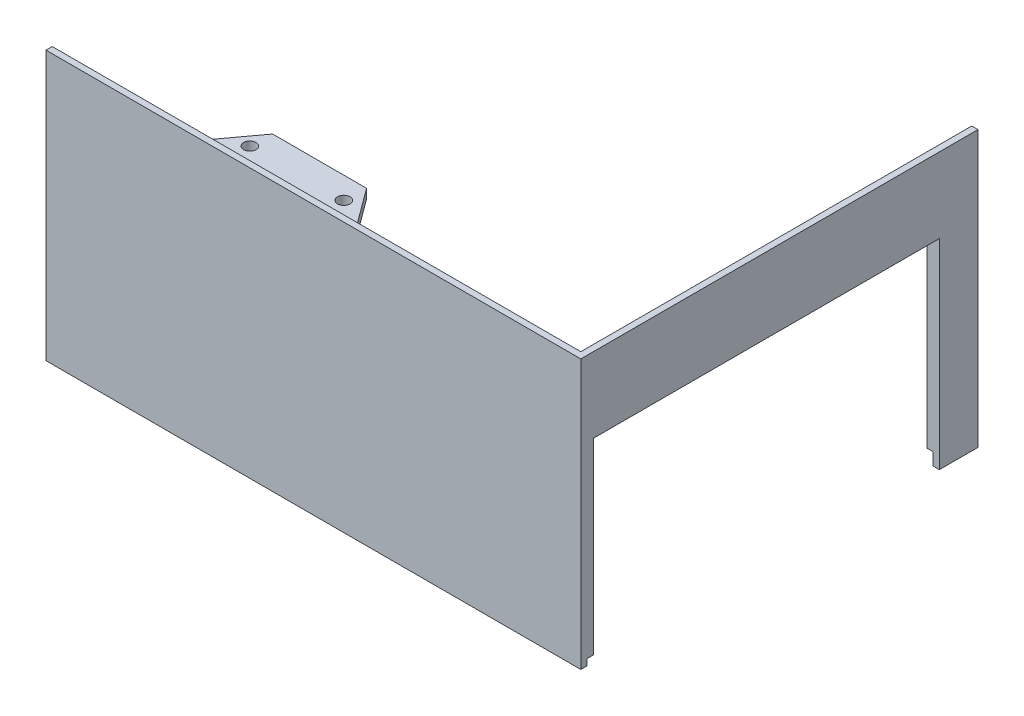
ISO-10303-21;
HEADER;
FILE_DESCRIPTION(('STEP AP214'),'2;1');
FILE_NAME('part.step','',(''),(''),'','','');
FILE_SCHEMA(('AUTOMOTIVE_DESIGN { 1 0 10303 214 1 1 1 1 }'));
ENDSEC;
DATA;
#1=APPLICATION_CONTEXT('core data for automotive mechanical design processes');
#2=APPLICATION_PROTOCOL_DEFINITION('international standard','automotive_design',2000,#1);
#3=PRODUCT_CONTEXT('',#1,'mechanical');
#4=PRODUCT('Part','Part','',(#3));
#5=PRODUCT_RELATED_PRODUCT_CATEGORY('part','',(#4));
#6=PRODUCT_DEFINITION_FORMATION('','',#4);
#7=PRODUCT_DEFINITION_CONTEXT('part definition',#1,'design');
#8=PRODUCT_DEFINITION('design','',#6,#7);
#9=PRODUCT_DEFINITION_SHAPE('','',#8);
#10=(LENGTH_UNIT() NAMED_UNIT(*) SI_UNIT(.MILLI.,.METRE.));
#11=(NAMED_UNIT(*) PLANE_ANGLE_UNIT() SI_UNIT($,.RADIAN.));
#12=(NAMED_UNIT(*) SI_UNIT($,.STERADIAN.) SOLID_ANGLE_UNIT());
#13=UNCERTAINTY_MEASURE_WITH_UNIT(LENGTH_MEASURE(1.E-05),#10,'distance_accuracy_value','');
#14=(GEOMETRIC_REPRESENTATION_CONTEXT(3) GLOBAL_UNCERTAINTY_ASSIGNED_CONTEXT((#13)) GLOBAL_UNIT_ASSIGNED_CONTEXT((#10,
#11,#12)) REPRESENTATION_CONTEXT('',''));
#15=CARTESIAN_POINT('',(0.,0.,0.));
#16=DIRECTION('',(0.,0.,1.));
#17=DIRECTION('',(1.,0.,0.));
#18=AXIS2_PLACEMENT_3D('',#15,#16,#17);
#19=CARTESIAN_POINT('',(0.,0.,-4.));
#20=DIRECTION('',(0.,0.,-1.));
#21=DIRECTION('',(1.,0.,0.));
#22=AXIS2_PLACEMENT_3D('',#19,#20,#21);
#23=PLANE('',#22);
#24=DIRECTION('',(0.,1.,0.));
#25=VECTOR('',#24,1.);
#26=CARTESIAN_POINT('',(9.57742396503259,36.,-4.));
#27=LINE('',#26,#25);
#28=CARTESIAN_POINT('',(9.57742396503259,36.,-4.));
#29=VERTEX_POINT('',#28);
#30=CARTESIAN_POINT('',(9.57742396503259,39.,-4.));
#31=VERTEX_POINT('',#30);
#32=EDGE_CURVE('E224',#29,#31,#27,.T.);
#33=ORIENTED_EDGE('',*,*,#32,.T.);
#34=DIRECTION('',(1.,0.,0.));
#35=VECTOR('',#34,1.);
#36=CARTESIAN_POINT('',(0.,39.,-4.));
#37=LINE('',#36,#35);
#38=CARTESIAN_POINT('',(81.5,39.,-4.));
#39=VERTEX_POINT('',#38);
#40=EDGE_CURVE('E385',#31,#39,#37,.T.);
#41=ORIENTED_EDGE('',*,*,#40,.T.);
#42=DIRECTION('',(0.,-1.,0.));
#43=VECTOR('',#42,1.);
#44=CARTESIAN_POINT('',(81.5,0.,-4.));
#45=LINE('',#44,#43);
#46=CARTESIAN_POINT('',(81.5,19.,-4.));
#47=VERTEX_POINT('',#46);
#48=EDGE_CURVE('E310',#39,#47,#45,.T.);
#49=ORIENTED_EDGE('',*,*,#48,.T.);
#50=DIRECTION('',(1.,0.,0.));
#51=VECTOR('',#50,1.);
#52=CARTESIAN_POINT('',(81.5,19.,-4.));
#53=LINE('',#52,#51);
#54=CARTESIAN_POINT('',(85.5,19.,-4.));
#55=VERTEX_POINT('',#54);
#56=EDGE_CURVE('E332',#47,#55,#53,.T.);
#57=ORIENTED_EDGE('',*,*,#56,.T.);
#58=DIRECTION('',(0.,1.,0.));
#59=VECTOR('',#58,1.);
#60=CARTESIAN_POINT('',(85.5,0.,-4.));
#61=LINE('',#60,#59);
#62=CARTESIAN_POINT('',(85.5,-41.,-4.));
#63=VERTEX_POINT('',#62);
#64=EDGE_CURVE('E382',#63,#55,#61,.T.);
#65=ORIENTED_EDGE('',*,*,#64,.F.);
#66=DIRECTION('',(1.,0.,0.));
#67=VECTOR('',#66,1.);
#68=CARTESIAN_POINT('',(0.,-41.,-4.));
#69=LINE('',#68,#67);
#70=CARTESIAN_POINT('',(9.57742396503259,-41.,-4.));
#71=VERTEX_POINT('',#70);
#72=EDGE_CURVE('E377',#71,#63,#69,.T.);
#73=ORIENTED_EDGE('',*,*,#72,.F.);
#74=DIRECTION('',(0.,-1.,0.));
#75=VECTOR('',#74,1.);
#76=CARTESIAN_POINT('',(9.57742396503259,-38.,-4.));
#77=LINE('',#76,#75);
#78=CARTESIAN_POINT('',(9.57742396503259,-38.,-4.));
#79=VERTEX_POINT('',#78);
#80=EDGE_CURVE('E266',#79,#71,#77,.T.);
#81=ORIENTED_EDGE('',*,*,#80,.F.);
#82=DIRECTION('',(-1.,0.,0.));
#83=VECTOR('',#82,1.);
#84=CARTESIAN_POINT('',(0.,-38.,-4.));
#85=LINE('',#84,#83);
#86=CARTESIAN_POINT('',(-39.6274239650326,-38.,-4.));
#87=VERTEX_POINT('',#86);
#88=EDGE_CURVE('E257',#79,#87,#85,.T.);
#89=ORIENTED_EDGE('',*,*,#88,.T.);
#90=DIRECTION('',(0.,-1.,0.));
#91=VECTOR('',#90,1.);
#92=CARTESIAN_POINT('',(-39.6274239650326,-38.,-4.));
#93=LINE('',#92,#91);
#94=CARTESIAN_POINT('',(-39.6274239650326,-41.,-4.));
#95=VERTEX_POINT('',#94);
#96=EDGE_CURVE('E269',#87,#95,#93,.T.);
#97=ORIENTED_EDGE('',*,*,#96,.T.);
#98=CARTESIAN_POINT('',(-85.5,-41.,-4.));
#99=VERTEX_POINT('',#98);
#100=EDGE_CURVE('E379',#99,#95,#69,.T.);
#101=ORIENTED_EDGE('',*,*,#100,.F.);
#102=DIRECTION('',(0.,1.,0.));
#103=VECTOR('',#102,1.);
#104=CARTESIAN_POINT('',(-85.5,0.,-4.));
#105=LINE('',#104,#103);
#106=CARTESIAN_POINT('',(-85.5,39.,-4.));
#107=VERTEX_POINT('',#106);
#108=EDGE_CURVE('E374',#99,#107,#105,.T.);
#109=ORIENTED_EDGE('',*,*,#108,.T.);
#110=CARTESIAN_POINT('',(-39.6274239650326,39.,-4.));
#111=VERTEX_POINT('',#110);
#112=EDGE_CURVE('E386',#107,#111,#37,.T.);
#113=ORIENTED_EDGE('',*,*,#112,.T.);
#114=DIRECTION('',(0.,1.,0.));
#115=VECTOR('',#114,1.);
#116=CARTESIAN_POINT('',(-39.6274239650326,36.,-4.));
#117=LINE('',#116,#115);
#118=CARTESIAN_POINT('',(-39.6274239650326,36.,-4.));
#119=VERTEX_POINT('',#118);
#120=EDGE_CURVE('E227',#119,#111,#117,.T.);
#121=ORIENTED_EDGE('',*,*,#120,.F.);
#122=DIRECTION('',(-1.,0.,0.));
#123=VECTOR('',#122,1.);
#124=CARTESIAN_POINT('',(0.,36.,-4.));
#125=LINE('',#124,#123);
#126=EDGE_CURVE('E214',#29,#119,#125,.T.);
#127=ORIENTED_EDGE('',*,*,#126,.F.);
#128=EDGE_LOOP('',(#33,#41,#49,#57,#65,#73,#81,#89,#97,#101,#109,#113,#121,#127));
#129=FACE_BOUND('',#128,.T.);
#130=ADVANCED_FACE('F47',(#129),#23,.T.);
#131=CARTESIAN_POINT('',(81.5,-41.,0.));
#132=DIRECTION('',(0.,-1.,0.));
#133=DIRECTION('',(0.,0.,1.));
#134=AXIS2_PLACEMENT_3D('',#131,#132,#133);
#135=PLANE('',#134);
#136=DIRECTION('',(1.,0.,0.));
#137=VECTOR('',#136,1.);
#138=CARTESIAN_POINT('',(81.5,-41.,-114.644000153735));
#139=LINE('',#138,#137);
#140=CARTESIAN_POINT('',(81.5,-41.,-114.644000153735));
#141=VERTEX_POINT('',#140);
#142=CARTESIAN_POINT('',(83.5,-41.,-114.644000153735));
#143=VERTEX_POINT('',#142);
#144=EDGE_CURVE('E318',#141,#143,#139,.T.);
#145=ORIENTED_EDGE('',*,*,#144,.F.);
#146=DIRECTION('',(0.,0.,1.));
#147=VECTOR('',#146,1.);
#148=CARTESIAN_POINT('',(81.5,-41.,0.));
#149=LINE('',#148,#147);
#150=CARTESIAN_POINT('',(81.5,-41.,-127.));
#151=VERTEX_POINT('',#150);
#152=EDGE_CURVE('E302',#151,#141,#149,.T.);
#153=ORIENTED_EDGE('',*,*,#152,.F.);
#154=DIRECTION('',(1.,0.,0.));
#155=VECTOR('',#154,1.);
#156=CARTESIAN_POINT('',(81.5,-41.,-127.));
#157=LINE('',#156,#155);
#158=CARTESIAN_POINT('',(83.5,-41.,-127.));
#159=VERTEX_POINT('',#158);
#160=EDGE_CURVE('E325',#151,#159,#157,.T.);
#161=ORIENTED_EDGE('',*,*,#160,.T.);
#162=DIRECTION('',(0.,0.,1.));
#163=VECTOR('',#162,1.);
#164=CARTESIAN_POINT('',(83.5,-41.,0.));
#165=LINE('',#164,#163);
#166=EDGE_CURVE('E281',#159,#143,#165,.T.);
#167=ORIENTED_EDGE('',*,*,#166,.T.);
#168=EDGE_LOOP('',(#145,#153,#161,#167));
#169=FACE_BOUND('',#168,.T.);
#170=ADVANCED_FACE('F484',(#169),#135,.T.);
#171=CARTESIAN_POINT('',(0.,39.,-4.));
#172=DIRECTION('',(0.,1.,0.));
#173=DIRECTION('',(0.,0.,-1.));
#174=AXIS2_PLACEMENT_3D('',#171,#172,#173);
#175=PLANE('',#174);
#176=CARTESIAN_POINT('',(-0.300000000000009,39.,-10.02));
#177=DIRECTION('',(0.,-1.,0.));
#178=DIRECTION('',(0.,0.,-1.));
#179=AXIS2_PLACEMENT_3D('',#176,#177,#178);
#180=CIRCLE('',#179,2.);
#181=CARTESIAN_POINT('',(-0.300000000000009,39.,-12.02));
#182=VERTEX_POINT('',#181);
#183=EDGE_CURVE('E474',#182,#182,#180,.T.);
#184=ORIENTED_EDGE('',*,*,#183,.T.);
#185=EDGE_LOOP('',(#184));
#186=FACE_BOUND('',#185,.T.);
#187=CARTESIAN_POINT('',(-30.35,39.,-10.02));
#188=DIRECTION('',(0.,-1.,0.));
#189=DIRECTION('',(0.,0.,-1.));
#190=AXIS2_PLACEMENT_3D('',#187,#188,#189);
#191=CIRCLE('',#190,2.);
#192=CARTESIAN_POINT('',(-30.35,39.,-12.02));
#193=VERTEX_POINT('',#192);
#194=EDGE_CURVE('E662',#193,#193,#191,.T.);
#195=ORIENTED_EDGE('',*,*,#194,.T.);
#196=EDGE_LOOP('',(#195));
#197=FACE_BOUND('',#196,.T.);
#198=DIRECTION('',(1.,0.,0.));
#199=VECTOR('',#198,1.);
#200=CARTESIAN_POINT('',(81.5,39.,-127.));
#201=LINE('',#200,#199);
#202=CARTESIAN_POINT('',(81.5,39.,-127.));
#203=VERTEX_POINT('',#202);
#204=CARTESIAN_POINT('',(83.5,39.,-127.));
#205=VERTEX_POINT('',#204);
#206=EDGE_CURVE('E329',#203,#205,#201,.T.);
#207=ORIENTED_EDGE('',*,*,#206,.F.);
#208=DIRECTION('',(0.,0.,-1.));
#209=VECTOR('',#208,1.);
#210=CARTESIAN_POINT('',(81.5,39.,0.));
#211=LINE('',#210,#209);
#212=EDGE_CURVE('E313',#39,#203,#211,.T.);
#213=ORIENTED_EDGE('',*,*,#212,.F.);
#214=ORIENTED_EDGE('',*,*,#40,.F.);
#215=DIRECTION('',(0.593137889518411,0.,0.805100890583065));
#216=VECTOR('',#215,1.);
#217=CARTESIAN_POINT('',(8.11810933252715,39.,-5.98081345170003));
#218=LINE('',#217,#216);
#219=CARTESIAN_POINT('',(0.,39.,-17.));
#220=VERTEX_POINT('',#219);
#221=EDGE_CURVE('E62',#220,#31,#218,.T.);
#222=ORIENTED_EDGE('',*,*,#221,.F.);
#223=DIRECTION('',(1.,0.,0.));
#224=VECTOR('',#223,1.);
#225=CARTESIAN_POINT('',(0.,39.,-17.));
#226=LINE('',#225,#224);
#227=CARTESIAN_POINT('',(-30.05,39.,-17.));
#228=VERTEX_POINT('',#227);
#229=EDGE_CURVE('E219',#228,#220,#226,.T.);
#230=ORIENTED_EDGE('',*,*,#229,.F.);
#231=DIRECTION('',(-0.59313788951841,0.,0.805100890583066));
#232=VECTOR('',#231,1.);
#233=CARTESIAN_POINT('',(-27.5961420252574,39.,-20.3307655365495));
#234=LINE('',#233,#232);
#235=EDGE_CURVE('E466',#228,#111,#234,.T.);
#236=ORIENTED_EDGE('',*,*,#235,.T.);
#237=ORIENTED_EDGE('',*,*,#112,.F.);
#238=DIRECTION('',(0.,0.,1.));
#239=VECTOR('',#238,1.);
#240=CARTESIAN_POINT('',(-85.5,39.,-4.));
#241=LINE('',#240,#239);
#242=CARTESIAN_POINT('',(-85.5,39.,-2.));
#243=VERTEX_POINT('',#242);
#244=EDGE_CURVE('E388',#107,#243,#241,.T.);
#245=ORIENTED_EDGE('',*,*,#244,.T.);
#246=DIRECTION('',(1.,0.,0.));
#247=VECTOR('',#246,1.);
#248=CARTESIAN_POINT('',(0.,39.,-2.));
#249=LINE('',#248,#247);
#250=CARTESIAN_POINT('',(83.5,39.,-2.));
#251=VERTEX_POINT('',#250);
#252=EDGE_CURVE('E360',#243,#251,#249,.T.);
#253=ORIENTED_EDGE('',*,*,#252,.T.);
#254=DIRECTION('',(0.,0.,-1.));
#255=VECTOR('',#254,1.);
#256=CARTESIAN_POINT('',(83.5,39.,0.));
#257=LINE('',#256,#255);
#258=EDGE_CURVE('E289',#251,#205,#257,.T.);
#259=ORIENTED_EDGE('',*,*,#258,.T.);
#260=EDGE_LOOP('',(#207,#213,#214,#222,#230,#236,#237,#245,#253,#259));
#261=FACE_BOUND('',#260,.T.);
#262=ADVANCED_FACE('F463',(#186,#197,#261),#175,.T.);
#263=CARTESIAN_POINT('',(0.,0.,-2.));
#264=DIRECTION('',(0.,0.,-1.));
#265=DIRECTION('',(1.,0.,0.));
#266=AXIS2_PLACEMENT_3D('',#263,#264,#265);
#267=PLANE('',#266);
#268=ORIENTED_EDGE('',*,*,#252,.F.);
#269=DIRECTION('',(0.,1.,0.));
#270=VECTOR('',#269,1.);
#271=CARTESIAN_POINT('',(-85.5,0.,-2.));
#272=LINE('',#271,#270);
#273=CARTESIAN_POINT('',(-85.5,43.,-2.));
#274=VERTEX_POINT('',#273);
#275=EDGE_CURVE('E357',#243,#274,#272,.T.);
#276=ORIENTED_EDGE('',*,*,#275,.T.);
#277=DIRECTION('',(-1.,0.,0.));
#278=VECTOR('',#277,1.);
#279=CARTESIAN_POINT('',(0.,43.,-2.));
#280=LINE('',#279,#278);
#281=CARTESIAN_POINT('',(83.5,43.,-2.));
#282=VERTEX_POINT('',#281);
#283=EDGE_CURVE('E363',#282,#274,#280,.T.);
#284=ORIENTED_EDGE('',*,*,#283,.F.);
#285=DIRECTION('',(0.,-1.,0.));
#286=VECTOR('',#285,1.);
#287=CARTESIAN_POINT('',(83.5,0.,-2.));
#288=LINE('',#287,#286);
#289=EDGE_CURVE('E293',#282,#251,#288,.T.);
#290=ORIENTED_EDGE('',*,*,#289,.T.);
#291=EDGE_LOOP('',(#268,#276,#284,#290));
#292=FACE_BOUND('',#291,.T.);
#293=ADVANCED_FACE('F458',(#292),#267,.T.);
#294=CARTESIAN_POINT('',(-85.5,0.,-4.));
#295=DIRECTION('',(-1.,0.,0.));
#296=DIRECTION('',(0.,0.,-1.));
#297=AXIS2_PLACEMENT_3D('',#294,#295,#296);
#298=PLANE('',#297);
#299=DIRECTION('',(0.,1.,0.));
#300=VECTOR('',#299,1.);
#301=CARTESIAN_POINT('',(-85.5,0.,0.));
#302=LINE('',#301,#300);
#303=CARTESIAN_POINT('',(-85.5,-43.,0.));
#304=VERTEX_POINT('',#303);
#305=CARTESIAN_POINT('',(-85.5,43.,0.));
#306=VERTEX_POINT('',#305);
#307=EDGE_CURVE('E373',#304,#306,#302,.T.);
#308=ORIENTED_EDGE('',*,*,#307,.T.);
#309=DIRECTION('',(0.,0.,1.));
#310=VECTOR('',#309,1.);
#311=CARTESIAN_POINT('',(-85.5,43.,-2.));
#312=LINE('',#311,#310);
#313=EDGE_CURVE('E366',#274,#306,#312,.T.);
#314=ORIENTED_EDGE('',*,*,#313,.F.);
#315=ORIENTED_EDGE('',*,*,#275,.F.);
#316=ORIENTED_EDGE('',*,*,#244,.F.);
#317=ORIENTED_EDGE('',*,*,#108,.F.);
#318=DIRECTION('',(0.,0.,1.));
#319=VECTOR('',#318,1.);
#320=CARTESIAN_POINT('',(-85.5,-41.,-4.));
#321=LINE('',#320,#319);
#322=CARTESIAN_POINT('',(-85.5,-41.,-2.));
#323=VERTEX_POINT('',#322);
#324=EDGE_CURVE('E11',#99,#323,#321,.T.);
#325=ORIENTED_EDGE('',*,*,#324,.T.);
#326=DIRECTION('',(0.,1.,0.));
#327=VECTOR('',#326,1.);
#328=CARTESIAN_POINT('',(-85.5,0.,-2.));
#329=LINE('',#328,#327);
#330=CARTESIAN_POINT('',(-85.5,-43.,-2.));
#331=VERTEX_POINT('',#330);
#332=EDGE_CURVE('E342',#331,#323,#329,.T.);
#333=ORIENTED_EDGE('',*,*,#332,.F.);
#334=DIRECTION('',(0.,0.,1.));
#335=VECTOR('',#334,1.);
#336=CARTESIAN_POINT('',(-85.5,-43.,-2.));
#337=LINE('',#336,#335);
#338=EDGE_CURVE('E353',#331,#304,#337,.T.);
#339=ORIENTED_EDGE('',*,*,#338,.T.);
#340=EDGE_LOOP('',(#308,#314,#315,#316,#317,#325,#333,#339));
#341=FACE_BOUND('',#340,.T.);
#342=ADVANCED_FACE('F49',(#341),#298,.T.);
#343=CARTESIAN_POINT('',(0.,-41.,-4.));
#344=DIRECTION('',(0.,1.,0.));
#345=DIRECTION('',(0.,0.,-1.));
#346=AXIS2_PLACEMENT_3D('',#343,#344,#345);
#347=PLANE('',#346);
#348=CARTESIAN_POINT('',(-0.300000000000009,-41.,-10.02));
#349=DIRECTION('',(0.,-1.,0.));
#350=DIRECTION('',(0.,0.,-1.));
#351=AXIS2_PLACEMENT_3D('',#348,#349,#350);
#352=CIRCLE('',#351,2.);
#353=CARTESIAN_POINT('',(-0.300000000000009,-41.,-12.02));
#354=VERTEX_POINT('',#353);
#355=EDGE_CURVE('E237',#354,#354,#352,.T.);
#356=ORIENTED_EDGE('',*,*,#355,.F.);
#357=EDGE_LOOP('',(#356));
#358=FACE_BOUND('',#357,.T.);
#359=CARTESIAN_POINT('',(-30.35,-41.,-10.02));
#360=DIRECTION('',(0.,-1.,0.));
#361=DIRECTION('',(0.,0.,-1.));
#362=AXIS2_PLACEMENT_3D('',#359,#360,#361);
#363=CIRCLE('',#362,2.);
#364=CARTESIAN_POINT('',(-30.35,-41.,-12.02));
#365=VERTEX_POINT('',#364);
#366=EDGE_CURVE('E247',#365,#365,#363,.T.);
#367=ORIENTED_EDGE('',*,*,#366,.F.);
#368=EDGE_LOOP('',(#367));
#369=FACE_BOUND('',#368,.T.);
#370=ORIENTED_EDGE('',*,*,#324,.F.);
#371=ORIENTED_EDGE('',*,*,#100,.T.);
#372=DIRECTION('',(-0.59313788951841,0.,0.805100890583066));
#373=VECTOR('',#372,1.);
#374=CARTESIAN_POINT('',(-27.5961420252574,-41.,-20.3307655365495));
#375=LINE('',#374,#373);
#376=CARTESIAN_POINT('',(-30.05,-41.,-17.));
#377=VERTEX_POINT('',#376);
#378=EDGE_CURVE('E253',#377,#95,#375,.T.);
#379=ORIENTED_EDGE('',*,*,#378,.F.);
#380=DIRECTION('',(1.,0.,0.));
#381=VECTOR('',#380,1.);
#382=CARTESIAN_POINT('',(0.,-41.,-17.));
#383=LINE('',#382,#381);
#384=CARTESIAN_POINT('',(0.,-41.,-17.));
#385=VERTEX_POINT('',#384);
#386=EDGE_CURVE('E262',#377,#385,#383,.T.);
#387=ORIENTED_EDGE('',*,*,#386,.T.);
#388=DIRECTION('',(0.593137889518411,0.,0.805100890583065));
#389=VECTOR('',#388,1.);
#390=CARTESIAN_POINT('',(8.11810933252715,-41.,-5.98081345170003));
#391=LINE('',#390,#389);
#392=EDGE_CURVE('E240',#385,#71,#391,.T.);
#393=ORIENTED_EDGE('',*,*,#392,.T.);
#394=ORIENTED_EDGE('',*,*,#72,.T.);
#395=DIRECTION('',(0.,0.,1.));
#396=VECTOR('',#395,1.);
#397=CARTESIAN_POINT('',(85.5,-41.,-4.));
#398=LINE('',#397,#396);
#399=CARTESIAN_POINT('',(85.5,-41.,-2.));
#400=VERTEX_POINT('',#399);
#401=EDGE_CURVE('E55',#63,#400,#398,.T.);
#402=ORIENTED_EDGE('',*,*,#401,.T.);
#403=DIRECTION('',(1.,0.,0.));
#404=VECTOR('',#403,1.);
#405=CARTESIAN_POINT('',(0.,-41.,-2.));
#406=LINE('',#405,#404);
#407=EDGE_CURVE('E339',#323,#400,#406,.T.);
#408=ORIENTED_EDGE('',*,*,#407,.F.);
#409=EDGE_LOOP('',(#370,#371,#379,#387,#393,#394,#402,#408));
#410=FACE_BOUND('',#409,.T.);
#411=ADVANCED_FACE('F397',(#358,#369,#410),#347,.F.);
#412=CARTESIAN_POINT('',(85.5,0.,-4.));
#413=DIRECTION('',(-1.,0.,0.));
#414=DIRECTION('',(0.,0.,-1.));
#415=AXIS2_PLACEMENT_3D('',#412,#413,#414);
#416=PLANE('',#415);
#417=DIRECTION('',(0.,1.,0.));
#418=VECTOR('',#417,1.);
#419=CARTESIAN_POINT('',(85.5,0.,0.));
#420=LINE('',#419,#418);
#421=CARTESIAN_POINT('',(85.5,-43.,0.));
#422=VERTEX_POINT('',#421);
#423=CARTESIAN_POINT('',(85.5,43.,0.));
#424=VERTEX_POINT('',#423);
#425=EDGE_CURVE('E378',#422,#424,#420,.T.);
#426=ORIENTED_EDGE('',*,*,#425,.F.);
#427=DIRECTION('',(0.,0.,1.));
#428=VECTOR('',#427,1.);
#429=CARTESIAN_POINT('',(85.5,-43.,-2.));
#430=LINE('',#429,#428);
#431=CARTESIAN_POINT('',(85.5,-43.,-2.));
#432=VERTEX_POINT('',#431);
#433=EDGE_CURVE('E349',#432,#422,#430,.T.);
#434=ORIENTED_EDGE('',*,*,#433,.F.);
#435=DIRECTION('',(0.,1.,0.));
#436=VECTOR('',#435,1.);
#437=CARTESIAN_POINT('',(85.5,0.,-2.));
#438=LINE('',#437,#436);
#439=EDGE_CURVE('E347',#432,#400,#438,.T.);
#440=ORIENTED_EDGE('',*,*,#439,.T.);
#441=ORIENTED_EDGE('',*,*,#401,.F.);
#442=ORIENTED_EDGE('',*,*,#64,.T.);
#443=DIRECTION('',(0.,0.,1.));
#444=VECTOR('',#443,1.);
#445=CARTESIAN_POINT('',(85.5,19.,0.));
#446=LINE('',#445,#444);
#447=CARTESIAN_POINT('',(85.5,19.,-114.644000153735));
#448=VERTEX_POINT('',#447);
#449=EDGE_CURVE('E321',#448,#55,#446,.T.);
#450=ORIENTED_EDGE('',*,*,#449,.F.);
#451=DIRECTION('',(0.,1.,0.));
#452=VECTOR('',#451,1.);
#453=CARTESIAN_POINT('',(85.5,0.,-114.644000153735));
#454=LINE('',#453,#452);
#455=CARTESIAN_POINT('',(85.5,-45.,-114.644000153735));
#456=VERTEX_POINT('',#455);
#457=EDGE_CURVE('E301',#456,#448,#454,.T.);
#458=ORIENTED_EDGE('',*,*,#457,.F.);
#459=DIRECTION('',(0.,0.,-1.));
#460=VECTOR('',#459,1.);
#461=CARTESIAN_POINT('',(85.5,-45.,0.));
#462=LINE('',#461,#460);
#463=CARTESIAN_POINT('',(85.5,-45.,-127.));
#464=VERTEX_POINT('',#463);
#465=EDGE_CURVE('E268',#456,#464,#462,.T.);
#466=ORIENTED_EDGE('',*,*,#465,.T.);
#467=DIRECTION('',(0.,1.,0.));
#468=VECTOR('',#467,1.);
#469=CARTESIAN_POINT('',(85.5,0.,-127.));
#470=LINE('',#469,#468);
#471=CARTESIAN_POINT('',(85.5,43.,-127.));
#472=VERTEX_POINT('',#471);
#473=EDGE_CURVE('E306',#464,#472,#470,.T.);
#474=ORIENTED_EDGE('',*,*,#473,.T.);
#475=DIRECTION('',(0.,0.,1.));
#476=VECTOR('',#475,1.);
#477=CARTESIAN_POINT('',(85.5,43.,-2.));
#478=LINE('',#477,#476);
#479=EDGE_CURVE('E370',#472,#424,#478,.T.);
#480=ORIENTED_EDGE('',*,*,#479,.T.);
#481=EDGE_LOOP('',(#426,#434,#440,#441,#442,#450,#458,#466,#474,#480));
#482=FACE_BOUND('',#481,.T.);
#483=ADVANCED_FACE('F402',(#482),#416,.F.);
#484=CARTESIAN_POINT('',(0.,0.,0.));
#485=DIRECTION('',(0.,0.,-1.));
#486=DIRECTION('',(1.,0.,0.));
#487=AXIS2_PLACEMENT_3D('',#484,#485,#486);
#488=PLANE('',#487);
#489=ORIENTED_EDGE('',*,*,#307,.F.);
#490=DIRECTION('',(-1.,0.,0.));
#491=VECTOR('',#490,1.);
#492=CARTESIAN_POINT('',(0.,-43.,0.));
#493=LINE('',#492,#491);
#494=EDGE_CURVE('E328',#422,#304,#493,.T.);
#495=ORIENTED_EDGE('',*,*,#494,.F.);
#496=ORIENTED_EDGE('',*,*,#425,.T.);
#497=DIRECTION('',(-1.,0.,0.));
#498=VECTOR('',#497,1.);
#499=CARTESIAN_POINT('',(0.,43.,0.));
#500=LINE('',#499,#498);
#501=EDGE_CURVE('E356',#424,#306,#500,.T.);
#502=ORIENTED_EDGE('',*,*,#501,.T.);
#503=EDGE_LOOP('',(#489,#495,#496,#502));
#504=FACE_BOUND('',#503,.T.);
#505=ADVANCED_FACE('F449',(#504),#488,.F.);
#506=CARTESIAN_POINT('',(0.,43.,-2.));
#507=DIRECTION('',(0.,-1.,0.));
#508=DIRECTION('',(1.,0.,0.));
#509=AXIS2_PLACEMENT_3D('',#506,#507,#508);
#510=PLANE('',#509);
#511=ORIENTED_EDGE('',*,*,#501,.F.);
#512=ORIENTED_EDGE('',*,*,#479,.F.);
#513=DIRECTION('',(1.,0.,0.));
#514=VECTOR('',#513,1.);
#515=CARTESIAN_POINT('',(83.5,43.,-127.));
#516=LINE('',#515,#514);
#517=CARTESIAN_POINT('',(83.5,43.,-127.));
#518=VERTEX_POINT('',#517);
#519=EDGE_CURVE('E299',#518,#472,#516,.T.);
#520=ORIENTED_EDGE('',*,*,#519,.F.);
#521=DIRECTION('',(0.,0.,1.));
#522=VECTOR('',#521,1.);
#523=CARTESIAN_POINT('',(83.5,43.,0.));
#524=LINE('',#523,#522);
#525=EDGE_CURVE('E295',#518,#282,#524,.T.);
#526=ORIENTED_EDGE('',*,*,#525,.T.);
#527=ORIENTED_EDGE('',*,*,#283,.T.);
#528=ORIENTED_EDGE('',*,*,#313,.T.);
#529=EDGE_LOOP('',(#511,#512,#520,#526,#527,#528));
#530=FACE_BOUND('',#529,.T.);
#531=ADVANCED_FACE('F454',(#530),#510,.F.);
#532=CARTESIAN_POINT('',(0.,-43.,-2.));
#533=DIRECTION('',(0.,-1.,0.));
#534=DIRECTION('',(1.,0.,0.));
#535=AXIS2_PLACEMENT_3D('',#532,#533,#534);
#536=PLANE('',#535);
#537=ORIENTED_EDGE('',*,*,#494,.T.);
#538=ORIENTED_EDGE('',*,*,#338,.F.);
#539=DIRECTION('',(-1.,0.,0.));
#540=VECTOR('',#539,1.);
#541=CARTESIAN_POINT('',(0.,-43.,-2.));
#542=LINE('',#541,#540);
#543=EDGE_CURVE('E345',#432,#331,#542,.T.);
#544=ORIENTED_EDGE('',*,*,#543,.F.);
#545=ORIENTED_EDGE('',*,*,#433,.T.);
#546=EDGE_LOOP('',(#537,#538,#544,#545));
#547=FACE_BOUND('',#546,.T.);
#548=ADVANCED_FACE('F451',(#547),#536,.T.);
#549=CARTESIAN_POINT('',(0.,0.,-2.));
#550=DIRECTION('',(0.,0.,-1.));
#551=DIRECTION('',(1.,0.,0.));
#552=AXIS2_PLACEMENT_3D('',#549,#550,#551);
#553=PLANE('',#552);
#554=ORIENTED_EDGE('',*,*,#407,.T.);
#555=ORIENTED_EDGE('',*,*,#439,.F.);
#556=ORIENTED_EDGE('',*,*,#543,.T.);
#557=ORIENTED_EDGE('',*,*,#332,.T.);
#558=EDGE_LOOP('',(#554,#555,#556,#557));
#559=FACE_BOUND('',#558,.T.);
#560=ADVANCED_FACE('F407',(#559),#553,.T.);
#561=CARTESIAN_POINT('',(81.5,0.,-127.));
#562=DIRECTION('',(0.,0.,1.));
#563=DIRECTION('',(-1.,0.,0.));
#564=AXIS2_PLACEMENT_3D('',#561,#562,#563);
#565=PLANE('',#564);
#566=ORIENTED_EDGE('',*,*,#473,.F.);
#567=DIRECTION('',(1.,0.,0.));
#568=VECTOR('',#567,1.);
#569=CARTESIAN_POINT('',(83.5,-45.,-127.));
#570=LINE('',#569,#568);
#571=CARTESIAN_POINT('',(83.5,-45.,-127.));
#572=VERTEX_POINT('',#571);
#573=EDGE_CURVE('E284',#572,#464,#570,.T.);
#574=ORIENTED_EDGE('',*,*,#573,.F.);
#575=DIRECTION('',(0.,1.,0.));
#576=VECTOR('',#575,1.);
#577=CARTESIAN_POINT('',(83.5,0.,-127.));
#578=LINE('',#577,#576);
#579=EDGE_CURVE('E275',#572,#159,#578,.T.);
#580=ORIENTED_EDGE('',*,*,#579,.T.);
#581=ORIENTED_EDGE('',*,*,#160,.F.);
#582=DIRECTION('',(0.,1.,0.));
#583=VECTOR('',#582,1.);
#584=CARTESIAN_POINT('',(81.5,0.,-127.));
#585=LINE('',#584,#583);
#586=EDGE_CURVE('E316',#151,#203,#585,.T.);
#587=ORIENTED_EDGE('',*,*,#586,.T.);
#588=ORIENTED_EDGE('',*,*,#206,.T.);
#589=DIRECTION('',(0.,1.,0.));
#590=VECTOR('',#589,1.);
#591=CARTESIAN_POINT('',(83.5,0.,-127.));
#592=LINE('',#591,#590);
#593=EDGE_CURVE('E297',#205,#518,#592,.T.);
#594=ORIENTED_EDGE('',*,*,#593,.T.);
#595=ORIENTED_EDGE('',*,*,#519,.T.);
#596=EDGE_LOOP('',(#566,#574,#580,#581,#587,#588,#594,#595));
#597=FACE_BOUND('',#596,.T.);
#598=ADVANCED_FACE('F443',(#597),#565,.F.);
#599=CARTESIAN_POINT('',(81.5,19.,0.));
#600=DIRECTION('',(0.,-1.,0.));
#601=DIRECTION('',(0.,0.,1.));
#602=AXIS2_PLACEMENT_3D('',#599,#600,#601);
#603=PLANE('',#602);
#604=ORIENTED_EDGE('',*,*,#449,.T.);
#605=ORIENTED_EDGE('',*,*,#56,.F.);
#606=DIRECTION('',(0.,0.,1.));
#607=VECTOR('',#606,1.);
#608=CARTESIAN_POINT('',(81.5,19.,0.));
#609=LINE('',#608,#607);
#610=CARTESIAN_POINT('',(81.5,19.,-114.644000153735));
#611=VERTEX_POINT('',#610);
#612=EDGE_CURVE('E308',#611,#47,#609,.T.);
#613=ORIENTED_EDGE('',*,*,#612,.F.);
#614=DIRECTION('',(1.,0.,0.));
#615=VECTOR('',#614,1.);
#616=CARTESIAN_POINT('',(81.5,19.,-114.644000153735));
#617=LINE('',#616,#615);
#618=EDGE_CURVE('E335',#611,#448,#617,.T.);
#619=ORIENTED_EDGE('',*,*,#618,.T.);
#620=EDGE_LOOP('',(#604,#605,#613,#619));
#621=FACE_BOUND('',#620,.T.);
#622=ADVANCED_FACE('F429',(#621),#603,.T.);
#623=CARTESIAN_POINT('',(81.5,0.,-114.644000153735));
#624=DIRECTION('',(0.,0.,1.));
#625=DIRECTION('',(-1.,0.,0.));
#626=AXIS2_PLACEMENT_3D('',#623,#624,#625);
#627=PLANE('',#626);
#628=ORIENTED_EDGE('',*,*,#457,.T.);
#629=ORIENTED_EDGE('',*,*,#618,.F.);
#630=DIRECTION('',(0.,1.,0.));
#631=VECTOR('',#630,1.);
#632=CARTESIAN_POINT('',(81.5,0.,-114.644000153735));
#633=LINE('',#632,#631);
#634=EDGE_CURVE('E305',#141,#611,#633,.T.);
#635=ORIENTED_EDGE('',*,*,#634,.F.);
#636=ORIENTED_EDGE('',*,*,#144,.T.);
#637=DIRECTION('',(0.,1.,0.));
#638=VECTOR('',#637,1.);
#639=CARTESIAN_POINT('',(83.5,0.,-114.644000153735));
#640=LINE('',#639,#638);
#641=CARTESIAN_POINT('',(83.5,-45.,-114.644000153735));
#642=VERTEX_POINT('',#641);
#643=EDGE_CURVE('E279',#642,#143,#640,.T.);
#644=ORIENTED_EDGE('',*,*,#643,.F.);
#645=DIRECTION('',(1.,0.,0.));
#646=VECTOR('',#645,1.);
#647=CARTESIAN_POINT('',(83.5,-45.,-114.644000153735));
#648=LINE('',#647,#646);
#649=EDGE_CURVE('E287',#642,#456,#648,.T.);
#650=ORIENTED_EDGE('',*,*,#649,.T.);
#651=EDGE_LOOP('',(#628,#629,#635,#636,#644,#650));
#652=FACE_BOUND('',#651,.T.);
#653=ADVANCED_FACE('F434',(#652),#627,.T.);
#654=CARTESIAN_POINT('',(81.5,0.,0.));
#655=DIRECTION('',(1.,0.,0.));
#656=DIRECTION('',(0.,0.,1.));
#657=AXIS2_PLACEMENT_3D('',#654,#655,#656);
#658=PLANE('',#657);
#659=ORIENTED_EDGE('',*,*,#152,.T.);
#660=ORIENTED_EDGE('',*,*,#634,.T.);
#661=ORIENTED_EDGE('',*,*,#612,.T.);
#662=ORIENTED_EDGE('',*,*,#48,.F.);
#663=ORIENTED_EDGE('',*,*,#212,.T.);
#664=ORIENTED_EDGE('',*,*,#586,.F.);
#665=EDGE_LOOP('',(#659,#660,#661,#662,#663,#664));
#666=FACE_BOUND('',#665,.T.);
#667=ADVANCED_FACE('F480',(#666),#658,.F.);
#668=CARTESIAN_POINT('',(83.5,0.,0.));
#669=DIRECTION('',(1.,0.,0.));
#670=DIRECTION('',(0.,0.,1.));
#671=AXIS2_PLACEMENT_3D('',#668,#669,#670);
#672=PLANE('',#671);
#673=ORIENTED_EDGE('',*,*,#258,.F.);
#674=ORIENTED_EDGE('',*,*,#289,.F.);
#675=ORIENTED_EDGE('',*,*,#525,.F.);
#676=ORIENTED_EDGE('',*,*,#593,.F.);
#677=EDGE_LOOP('',(#673,#674,#675,#676));
#678=FACE_BOUND('',#677,.T.);
#679=ADVANCED_FACE('F490',(#678),#672,.F.);
#680=CARTESIAN_POINT('',(83.5,-45.,0.));
#681=DIRECTION('',(0.,1.,0.));
#682=DIRECTION('',(0.,0.,-1.));
#683=AXIS2_PLACEMENT_3D('',#680,#681,#682);
#684=PLANE('',#683);
#685=ORIENTED_EDGE('',*,*,#465,.F.);
#686=ORIENTED_EDGE('',*,*,#649,.F.);
#687=DIRECTION('',(0.,0.,-1.));
#688=VECTOR('',#687,1.);
#689=CARTESIAN_POINT('',(83.5,-45.,0.));
#690=LINE('',#689,#688);
#691=EDGE_CURVE('E277',#642,#572,#690,.T.);
#692=ORIENTED_EDGE('',*,*,#691,.T.);
#693=ORIENTED_EDGE('',*,*,#573,.T.);
#694=EDGE_LOOP('',(#685,#686,#692,#693));
#695=FACE_BOUND('',#694,.T.);
#696=ADVANCED_FACE('F438',(#695),#684,.F.);
#697=CARTESIAN_POINT('',(83.5,0.,0.));
#698=DIRECTION('',(1.,0.,0.));
#699=DIRECTION('',(0.,0.,1.));
#700=AXIS2_PLACEMENT_3D('',#697,#698,#699);
#701=PLANE('',#700);
#702=ORIENTED_EDGE('',*,*,#579,.F.);
#703=ORIENTED_EDGE('',*,*,#691,.F.);
#704=ORIENTED_EDGE('',*,*,#643,.T.);
#705=ORIENTED_EDGE('',*,*,#166,.F.);
#706=EDGE_LOOP('',(#702,#703,#704,#705));
#707=FACE_BOUND('',#706,.T.);
#708=ADVANCED_FACE('F488',(#707),#701,.F.);
#709=CARTESIAN_POINT('',(8.11810933252715,-38.,-5.98081345170003));
#710=DIRECTION('',(-0.805100890583065,0.,0.593137889518411));
#711=DIRECTION('',(-0.593137889518411,0.,-0.805100890583066));
#712=AXIS2_PLACEMENT_3D('',#709,#710,#711);
#713=PLANE('',#712);
#714=ORIENTED_EDGE('',*,*,#392,.F.);
#715=DIRECTION('',(0.,-1.,0.));
#716=VECTOR('',#715,1.);
#717=CARTESIAN_POINT('',(0.,-38.,-17.));
#718=LINE('',#717,#716);
#719=CARTESIAN_POINT('',(0.,-38.,-17.));
#720=VERTEX_POINT('',#719);
#721=EDGE_CURVE('E260',#720,#385,#718,.T.);
#722=ORIENTED_EDGE('',*,*,#721,.F.);
#723=DIRECTION('',(0.593137889518411,0.,0.805100890583065));
#724=VECTOR('',#723,1.);
#725=CARTESIAN_POINT('',(8.11810933252715,-38.,-5.98081345170003));
#726=LINE('',#725,#724);
#727=EDGE_CURVE('E70',#720,#79,#726,.T.);
#728=ORIENTED_EDGE('',*,*,#727,.T.);
#729=ORIENTED_EDGE('',*,*,#80,.T.);
#730=EDGE_LOOP('',(#714,#722,#728,#729));
#731=FACE_BOUND('',#730,.T.);
#732=ADVANCED_FACE('F424',(#731),#713,.F.);
#733=CARTESIAN_POINT('',(-27.5961420252574,-38.,-20.3307655365495));
#734=DIRECTION('',(-0.805100890583066,0.,-0.59313788951841));
#735=DIRECTION('',(0.59313788951841,0.,-0.805100890583066));
#736=AXIS2_PLACEMENT_3D('',#733,#734,#735);
#737=PLANE('',#736);
#738=ORIENTED_EDGE('',*,*,#378,.T.);
#739=ORIENTED_EDGE('',*,*,#96,.F.);
#740=DIRECTION('',(-0.59313788951841,0.,0.805100890583066));
#741=VECTOR('',#740,1.);
#742=CARTESIAN_POINT('',(-27.5961420252574,-38.,-20.3307655365495));
#743=LINE('',#742,#741);
#744=CARTESIAN_POINT('',(-30.05,-38.,-17.));
#745=VERTEX_POINT('',#744);
#746=EDGE_CURVE('E255',#745,#87,#743,.T.);
#747=ORIENTED_EDGE('',*,*,#746,.F.);
#748=DIRECTION('',(0.,-1.,0.));
#749=VECTOR('',#748,1.);
#750=CARTESIAN_POINT('',(-30.05,-38.,-17.));
#751=LINE('',#750,#749);
#752=EDGE_CURVE('E272',#745,#377,#751,.T.);
#753=ORIENTED_EDGE('',*,*,#752,.T.);
#754=EDGE_LOOP('',(#738,#739,#747,#753));
#755=FACE_BOUND('',#754,.T.);
#756=ADVANCED_FACE('F418',(#755),#737,.T.);
#757=CARTESIAN_POINT('',(0.,-38.,-17.));
#758=DIRECTION('',(0.,0.,1.));
#759=DIRECTION('',(-1.,0.,0.));
#760=AXIS2_PLACEMENT_3D('',#757,#758,#759);
#761=PLANE('',#760);
#762=ORIENTED_EDGE('',*,*,#386,.F.);
#763=ORIENTED_EDGE('',*,*,#752,.F.);
#764=DIRECTION('',(1.,0.,0.));
#765=VECTOR('',#764,1.);
#766=CARTESIAN_POINT('',(0.,-38.,-17.));
#767=LINE('',#766,#765);
#768=EDGE_CURVE('E252',#745,#720,#767,.T.);
#769=ORIENTED_EDGE('',*,*,#768,.T.);
#770=ORIENTED_EDGE('',*,*,#721,.T.);
#771=EDGE_LOOP('',(#762,#763,#769,#770));
#772=FACE_BOUND('',#771,.T.);
#773=ADVANCED_FACE('F422',(#772),#761,.F.);
#774=CARTESIAN_POINT('',(0.,-38.,0.));
#775=DIRECTION('',(0.,-1.,0.));
#776=DIRECTION('',(0.,0.,1.));
#777=AXIS2_PLACEMENT_3D('',#774,#775,#776);
#778=PLANE('',#777);
#779=CARTESIAN_POINT('',(-0.300000000000009,-38.,-10.02));
#780=DIRECTION('',(0.,-1.,0.));
#781=DIRECTION('',(0.,0.,-1.));
#782=AXIS2_PLACEMENT_3D('',#779,#780,#781);
#783=CIRCLE('',#782,2.);
#784=CARTESIAN_POINT('',(-0.300000000000009,-38.,-12.02));
#785=VERTEX_POINT('',#784);
#786=EDGE_CURVE('E241',#785,#785,#783,.T.);
#787=ORIENTED_EDGE('',*,*,#786,.T.);
#788=EDGE_LOOP('',(#787));
#789=FACE_BOUND('',#788,.T.);
#790=CARTESIAN_POINT('',(-30.35,-38.,-10.02));
#791=DIRECTION('',(0.,-1.,0.));
#792=DIRECTION('',(0.,0.,-1.));
#793=AXIS2_PLACEMENT_3D('',#790,#791,#792);
#794=CIRCLE('',#793,2.);
#795=CARTESIAN_POINT('',(-30.35,-38.,-12.02));
#796=VERTEX_POINT('',#795);
#797=EDGE_CURVE('E244',#796,#796,#794,.T.);
#798=ORIENTED_EDGE('',*,*,#797,.T.);
#799=EDGE_LOOP('',(#798));
#800=FACE_BOUND('',#799,.T.);
#801=ORIENTED_EDGE('',*,*,#727,.F.);
#802=ORIENTED_EDGE('',*,*,#768,.F.);
#803=ORIENTED_EDGE('',*,*,#746,.T.);
#804=ORIENTED_EDGE('',*,*,#88,.F.);
#805=EDGE_LOOP('',(#801,#802,#803,#804));
#806=FACE_BOUND('',#805,.T.);
#807=ADVANCED_FACE('F527',(#789,#800,#806),#778,.F.);
#808=CARTESIAN_POINT('',(-30.35,-41.,-10.02));
#809=DIRECTION('',(0.,1.,0.));
#810=DIRECTION('',(0.,0.,-1.));
#811=AXIS2_PLACEMENT_3D('',#808,#809,#810);
#812=CYLINDRICAL_SURFACE('',#811,2.);
#813=ORIENTED_EDGE('',*,*,#366,.T.);
#814=EDGE_LOOP('',(#813));
#815=FACE_BOUND('',#814,.T.);
#816=ORIENTED_EDGE('',*,*,#797,.F.);
#817=EDGE_LOOP('',(#816));
#818=FACE_BOUND('',#817,.T.);
#819=ADVANCED_FACE('F523',(#815,#818),#812,.F.);
#820=CARTESIAN_POINT('',(-0.300000000000009,-41.,-10.02));
#821=DIRECTION('',(0.,1.,0.));
#822=DIRECTION('',(0.,0.,-1.));
#823=AXIS2_PLACEMENT_3D('',#820,#821,#822);
#824=CYLINDRICAL_SURFACE('',#823,2.);
#825=ORIENTED_EDGE('',*,*,#355,.T.);
#826=EDGE_LOOP('',(#825));
#827=FACE_BOUND('',#826,.T.);
#828=ORIENTED_EDGE('',*,*,#786,.F.);
#829=EDGE_LOOP('',(#828));
#830=FACE_BOUND('',#829,.T.);
#831=ADVANCED_FACE('F526',(#827,#830),#824,.F.);
#832=CARTESIAN_POINT('',(8.11810933252715,36.,-5.98081345170003));
#833=DIRECTION('',(0.805100890583065,0.,-0.593137889518411));
#834=DIRECTION('',(0.593137889518411,0.,0.805100890583066));
#835=AXIS2_PLACEMENT_3D('',#832,#833,#834);
#836=PLANE('',#835);
#837=ORIENTED_EDGE('',*,*,#221,.T.);
#838=ORIENTED_EDGE('',*,*,#32,.F.);
#839=DIRECTION('',(0.593137889518411,0.,0.805100890583065));
#840=VECTOR('',#839,1.);
#841=CARTESIAN_POINT('',(8.11810933252715,36.,-5.98081345170003));
#842=LINE('',#841,#840);
#843=CARTESIAN_POINT('',(0.,36.,-17.));
#844=VERTEX_POINT('',#843);
#845=EDGE_CURVE('E211',#844,#29,#842,.T.);
#846=ORIENTED_EDGE('',*,*,#845,.F.);
#847=DIRECTION('',(0.,1.,0.));
#848=VECTOR('',#847,1.);
#849=CARTESIAN_POINT('',(0.,36.,-17.));
#850=LINE('',#849,#848);
#851=EDGE_CURVE('E250',#844,#220,#850,.T.);
#852=ORIENTED_EDGE('',*,*,#851,.T.);
#853=EDGE_LOOP('',(#837,#838,#846,#852));
#854=FACE_BOUND('',#853,.T.);
#855=ADVANCED_FACE('F230',(#854),#836,.T.);
#856=CARTESIAN_POINT('',(0.,36.,-17.));
#857=DIRECTION('',(0.,0.,-1.));
#858=DIRECTION('',(1.,0.,0.));
#859=AXIS2_PLACEMENT_3D('',#856,#857,#858);
#860=PLANE('',#859);
#861=ORIENTED_EDGE('',*,*,#229,.T.);
#862=ORIENTED_EDGE('',*,*,#851,.F.);
#863=DIRECTION('',(1.,0.,0.));
#864=VECTOR('',#863,1.);
#865=CARTESIAN_POINT('',(0.,36.,-17.));
#866=LINE('',#865,#864);
#867=CARTESIAN_POINT('',(-30.05,36.,-17.));
#868=VERTEX_POINT('',#867);
#869=EDGE_CURVE('E217',#868,#844,#866,.T.);
#870=ORIENTED_EDGE('',*,*,#869,.F.);
#871=DIRECTION('',(0.,1.,0.));
#872=VECTOR('',#871,1.);
#873=CARTESIAN_POINT('',(-30.05,36.,-17.));
#874=LINE('',#873,#872);
#875=EDGE_CURVE('E232',#868,#228,#874,.T.);
#876=ORIENTED_EDGE('',*,*,#875,.T.);
#877=EDGE_LOOP('',(#861,#862,#870,#876));
#878=FACE_BOUND('',#877,.T.);
#879=ADVANCED_FACE('F478',(#878),#860,.T.);
#880=CARTESIAN_POINT('',(-27.5961420252574,36.,-20.3307655365495));
#881=DIRECTION('',(0.805100890583066,0.,0.59313788951841));
#882=DIRECTION('',(-0.59313788951841,0.,0.805100890583066));
#883=AXIS2_PLACEMENT_3D('',#880,#881,#882);
#884=PLANE('',#883);
#885=ORIENTED_EDGE('',*,*,#235,.F.);
#886=ORIENTED_EDGE('',*,*,#875,.F.);
#887=DIRECTION('',(-0.59313788951841,0.,0.805100890583066));
#888=VECTOR('',#887,1.);
#889=CARTESIAN_POINT('',(-27.5961420252574,36.,-20.3307655365495));
#890=LINE('',#889,#888);
#891=EDGE_CURVE('E228',#868,#119,#890,.T.);
#892=ORIENTED_EDGE('',*,*,#891,.T.);
#893=ORIENTED_EDGE('',*,*,#120,.T.);
#894=EDGE_LOOP('',(#885,#886,#892,#893));
#895=FACE_BOUND('',#894,.T.);
#896=ADVANCED_FACE('F471',(#895),#884,.F.);
#897=CARTESIAN_POINT('',(0.,36.,0.));
#898=DIRECTION('',(0.,1.,0.));
#899=DIRECTION('',(0.,0.,1.));
#900=AXIS2_PLACEMENT_3D('',#897,#898,#899);
#901=PLANE('',#900);
#902=CARTESIAN_POINT('',(-0.300000000000009,36.,-10.02));
#903=DIRECTION('',(0.,-1.,0.));
#904=DIRECTION('',(0.,0.,-1.));
#905=AXIS2_PLACEMENT_3D('',#902,#903,#904);
#906=CIRCLE('',#905,2.);
#907=CARTESIAN_POINT('',(-0.300000000000009,36.,-12.02));
#908=VERTEX_POINT('',#907);
#909=EDGE_CURVE('E661',#908,#908,#906,.T.);
#910=ORIENTED_EDGE('',*,*,#909,.F.);
#911=EDGE_LOOP('',(#910));
#912=FACE_BOUND('',#911,.T.);
#913=CARTESIAN_POINT('',(-30.35,36.,-10.02));
#914=DIRECTION('',(0.,-1.,0.));
#915=DIRECTION('',(0.,0.,-1.));
#916=AXIS2_PLACEMENT_3D('',#913,#914,#915);
#917=CIRCLE('',#916,2.);
#918=CARTESIAN_POINT('',(-30.35,36.,-12.02));
#919=VERTEX_POINT('',#918);
#920=EDGE_CURVE('E666',#919,#919,#917,.T.);
#921=ORIENTED_EDGE('',*,*,#920,.F.);
#922=EDGE_LOOP('',(#921));
#923=FACE_BOUND('',#922,.T.);
#924=ORIENTED_EDGE('',*,*,#845,.T.);
#925=ORIENTED_EDGE('',*,*,#126,.T.);
#926=ORIENTED_EDGE('',*,*,#891,.F.);
#927=ORIENTED_EDGE('',*,*,#869,.T.);
#928=EDGE_LOOP('',(#924,#925,#926,#927));
#929=FACE_BOUND('',#928,.T.);
#930=ADVANCED_FACE('F213',(#912,#923,#929),#901,.F.);
#931=CARTESIAN_POINT('',(-30.35,39.,-10.02));
#932=DIRECTION('',(0.,-1.,0.));
#933=DIRECTION('',(0.,0.,1.));
#934=AXIS2_PLACEMENT_3D('',#931,#932,#933);
#935=CYLINDRICAL_SURFACE('',#934,2.);
#936=ORIENTED_EDGE('',*,*,#194,.F.);
#937=EDGE_LOOP('',(#936));
#938=FACE_BOUND('',#937,.T.);
#939=ORIENTED_EDGE('',*,*,#920,.T.);
#940=EDGE_LOOP('',(#939));
#941=FACE_BOUND('',#940,.T.);
#942=ADVANCED_FACE('F627',(#938,#941),#935,.F.);
#943=CARTESIAN_POINT('',(-0.300000000000009,39.,-10.02));
#944=DIRECTION('',(0.,-1.,0.));
#945=DIRECTION('',(0.,0.,1.));
#946=AXIS2_PLACEMENT_3D('',#943,#944,#945);
#947=CYLINDRICAL_SURFACE('',#946,2.);
#948=ORIENTED_EDGE('',*,*,#183,.F.);
#949=EDGE_LOOP('',(#948));
#950=FACE_BOUND('',#949,.T.);
#951=ORIENTED_EDGE('',*,*,#909,.T.);
#952=EDGE_LOOP('',(#951));
#953=FACE_BOUND('',#952,.T.);
#954=ADVANCED_FACE('F643',(#950,#953),#947,.F.);
#955=CLOSED_SHELL('',(#130,#170,#262,#293,#342,#411,#483,#505,#531,#548,#560,#598,#622,#653,
#667,#679,#696,#708,#732,#756,#773,#807,#819,#831,#855,#879,#896,#930,#942,#954));
#956=MANIFOLD_SOLID_BREP('B2',#955);
#957=ADVANCED_BREP_SHAPE_REPRESENTATION('',(#18,#956),#14);
#958=SHAPE_DEFINITION_REPRESENTATION(#9,#957);
ENDSEC;
END-ISO-10303-21;
